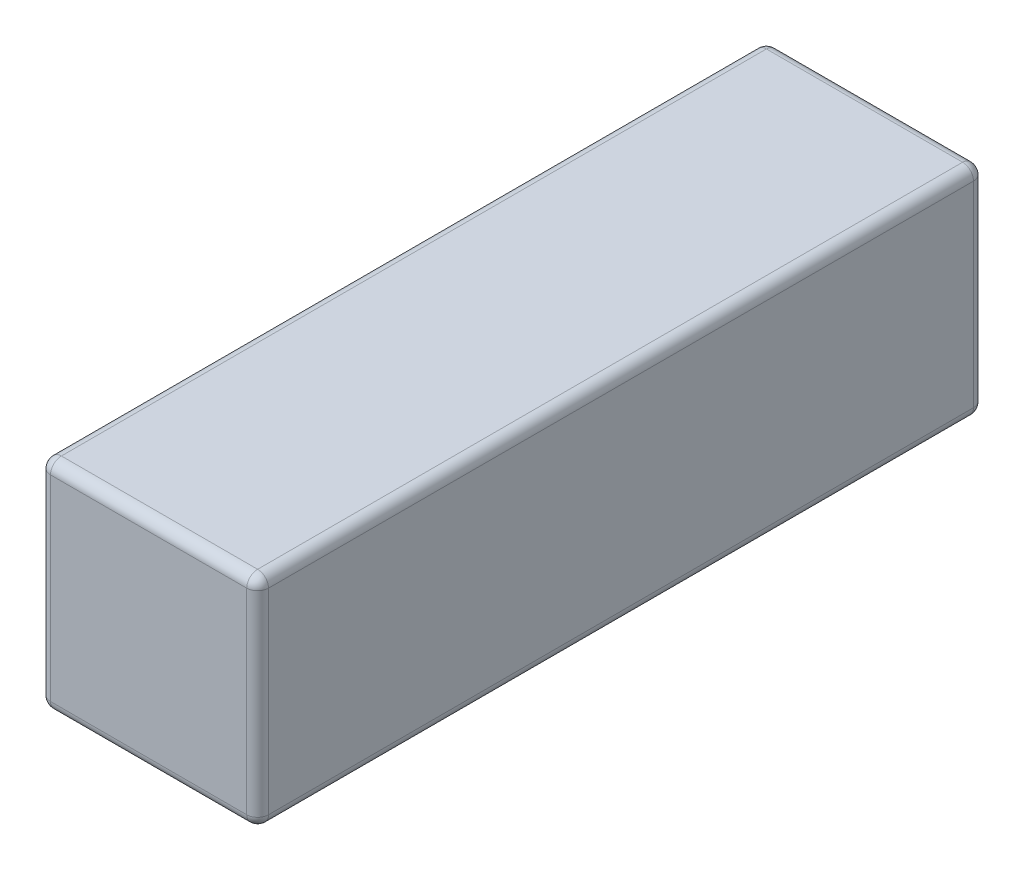
ISO-10303-21;
HEADER;
FILE_DESCRIPTION(('STEP AP214'),'2;1');
FILE_NAME('part.step','',(''),(''),'','','');
FILE_SCHEMA(('AUTOMOTIVE_DESIGN { 1 0 10303 214 1 1 1 1 }'));
ENDSEC;
DATA;
#1=APPLICATION_CONTEXT('core data for automotive mechanical design processes');
#2=APPLICATION_PROTOCOL_DEFINITION('international standard','automotive_design',2000,#1);
#3=PRODUCT_CONTEXT('',#1,'mechanical');
#4=PRODUCT('Part','Part','',(#3));
#5=PRODUCT_RELATED_PRODUCT_CATEGORY('part','',(#4));
#6=PRODUCT_DEFINITION_FORMATION('','',#4);
#7=PRODUCT_DEFINITION_CONTEXT('part definition',#1,'design');
#8=PRODUCT_DEFINITION('design','',#6,#7);
#9=PRODUCT_DEFINITION_SHAPE('','',#8);
#10=(LENGTH_UNIT() NAMED_UNIT(*) SI_UNIT(.MILLI.,.METRE.));
#11=(NAMED_UNIT(*) PLANE_ANGLE_UNIT() SI_UNIT($,.RADIAN.));
#12=(NAMED_UNIT(*) SI_UNIT($,.STERADIAN.) SOLID_ANGLE_UNIT());
#13=UNCERTAINTY_MEASURE_WITH_UNIT(LENGTH_MEASURE(1.E-05),#10,'distance_accuracy_value','');
#14=(GEOMETRIC_REPRESENTATION_CONTEXT(3) GLOBAL_UNCERTAINTY_ASSIGNED_CONTEXT((#13)) GLOBAL_UNIT_ASSIGNED_CONTEXT((#10,
#11,#12)) REPRESENTATION_CONTEXT('',''));
#15=CARTESIAN_POINT('',(0.,0.,0.));
#16=DIRECTION('',(0.,0.,1.));
#17=DIRECTION('',(1.,0.,0.));
#18=AXIS2_PLACEMENT_3D('',#15,#16,#17);
#19=CARTESIAN_POINT('',(1.5,-1.5,6.));
#20=DIRECTION('',(0.,1.,0.));
#21=DIRECTION('',(-1.,0.,0.));
#22=AXIS2_PLACEMENT_3D('',#19,#20,#21);
#23=PLANE('',#22);
#24=DIRECTION('',(0.,0.,-1.));
#25=VECTOR('',#24,1.);
#26=CARTESIAN_POINT('',(1.35,-1.5,6.));
#27=LINE('',#26,#25);
#28=CARTESIAN_POINT('',(1.35,-1.5,-5.85));
#29=VERTEX_POINT('',#28);
#30=CARTESIAN_POINT('',(1.35,-1.5,3.85));
#31=VERTEX_POINT('',#30);
#32=EDGE_CURVE('E140',#29,#31,#27,.F.);
#33=ORIENTED_EDGE('',*,*,#32,.T.);
#34=DIRECTION('',(1.,0.,0.));
#35=VECTOR('',#34,1.);
#36=CARTESIAN_POINT('',(1.5,-1.5,3.85));
#37=LINE('',#36,#35);
#38=CARTESIAN_POINT('',(-1.35,-1.5,3.85));
#39=VERTEX_POINT('',#38);
#40=EDGE_CURVE('E207',#31,#39,#37,.F.);
#41=ORIENTED_EDGE('',*,*,#40,.T.);
#42=DIRECTION('',(0.,0.,-1.));
#43=VECTOR('',#42,1.);
#44=CARTESIAN_POINT('',(-1.35,-1.5,6.));
#45=LINE('',#44,#43);
#46=CARTESIAN_POINT('',(-1.35,-1.5,-5.85));
#47=VERTEX_POINT('',#46);
#48=EDGE_CURVE('E143',#39,#47,#45,.T.);
#49=ORIENTED_EDGE('',*,*,#48,.T.);
#50=DIRECTION('',(1.,0.,0.));
#51=VECTOR('',#50,1.);
#52=CARTESIAN_POINT('',(1.5,-1.5,-5.85));
#53=LINE('',#52,#51);
#54=EDGE_CURVE('E138',#47,#29,#53,.T.);
#55=ORIENTED_EDGE('',*,*,#54,.T.);
#56=EDGE_LOOP('',(#33,#41,#49,#55));
#57=FACE_BOUND('',#56,.T.);
#58=ADVANCED_FACE('F47',(#57),#23,.F.);
#59=CARTESIAN_POINT('',(1.5,-1.5,6.));
#60=DIRECTION('',(-1.,0.,0.));
#61=DIRECTION('',(0.,0.,1.));
#62=AXIS2_PLACEMENT_3D('',#59,#60,#61);
#63=PLANE('',#62);
#64=DIRECTION('',(0.,0.,-1.));
#65=VECTOR('',#64,1.);
#66=CARTESIAN_POINT('',(1.5,1.35,6.));
#67=LINE('',#66,#65);
#68=CARTESIAN_POINT('',(1.5,1.35,-5.85));
#69=VERTEX_POINT('',#68);
#70=CARTESIAN_POINT('',(1.5,1.35,3.85));
#71=VERTEX_POINT('',#70);
#72=EDGE_CURVE('E195',#69,#71,#67,.F.);
#73=ORIENTED_EDGE('',*,*,#72,.T.);
#74=DIRECTION('',(0.,1.,0.));
#75=VECTOR('',#74,1.);
#76=CARTESIAN_POINT('',(1.5,-1.5,3.85));
#77=LINE('',#76,#75);
#78=CARTESIAN_POINT('',(1.5,-1.35,3.85));
#79=VERTEX_POINT('',#78);
#80=EDGE_CURVE('E204',#71,#79,#77,.F.);
#81=ORIENTED_EDGE('',*,*,#80,.T.);
#82=DIRECTION('',(0.,0.,-1.));
#83=VECTOR('',#82,1.);
#84=CARTESIAN_POINT('',(1.5,-1.35,6.));
#85=LINE('',#84,#83);
#86=CARTESIAN_POINT('',(1.5,-1.35,-5.85));
#87=VERTEX_POINT('',#86);
#88=EDGE_CURVE('E278',#79,#87,#85,.T.);
#89=ORIENTED_EDGE('',*,*,#88,.T.);
#90=DIRECTION('',(0.,1.,0.));
#91=VECTOR('',#90,1.);
#92=CARTESIAN_POINT('',(1.5,1.5,-5.85));
#93=LINE('',#92,#91);
#94=EDGE_CURVE('E279',#87,#69,#93,.T.);
#95=ORIENTED_EDGE('',*,*,#94,.T.);
#96=EDGE_LOOP('',(#73,#81,#89,#95));
#97=FACE_BOUND('',#96,.T.);
#98=ADVANCED_FACE('F284',(#97),#63,.F.);
#99=CARTESIAN_POINT('',(1.5,1.5,6.));
#100=DIRECTION('',(0.,-1.,0.));
#101=DIRECTION('',(1.,0.,0.));
#102=AXIS2_PLACEMENT_3D('',#99,#100,#101);
#103=PLANE('',#102);
#104=DIRECTION('',(0.,0.,-1.));
#105=VECTOR('',#104,1.);
#106=CARTESIAN_POINT('',(-1.35,1.5,6.));
#107=LINE('',#106,#105);
#108=CARTESIAN_POINT('',(-1.35,1.5,-5.85));
#109=VERTEX_POINT('',#108);
#110=CARTESIAN_POINT('',(-1.35,1.5,3.85));
#111=VERTEX_POINT('',#110);
#112=EDGE_CURVE('E276',#109,#111,#107,.F.);
#113=ORIENTED_EDGE('',*,*,#112,.T.);
#114=DIRECTION('',(-1.,0.,0.));
#115=VECTOR('',#114,1.);
#116=CARTESIAN_POINT('',(1.5,1.5,3.85));
#117=LINE('',#116,#115);
#118=CARTESIAN_POINT('',(1.35,1.5,3.85));
#119=VERTEX_POINT('',#118);
#120=EDGE_CURVE('E11',#111,#119,#117,.F.);
#121=ORIENTED_EDGE('',*,*,#120,.T.);
#122=DIRECTION('',(0.,0.,-1.));
#123=VECTOR('',#122,1.);
#124=CARTESIAN_POINT('',(1.35,1.5,6.));
#125=LINE('',#124,#123);
#126=CARTESIAN_POINT('',(1.35,1.5,-5.85));
#127=VERTEX_POINT('',#126);
#128=EDGE_CURVE('E272',#119,#127,#125,.T.);
#129=ORIENTED_EDGE('',*,*,#128,.T.);
#130=DIRECTION('',(-1.,0.,0.));
#131=VECTOR('',#130,1.);
#132=CARTESIAN_POINT('',(-1.5,1.5,-5.85));
#133=LINE('',#132,#131);
#134=EDGE_CURVE('E274',#127,#109,#133,.T.);
#135=ORIENTED_EDGE('',*,*,#134,.T.);
#136=EDGE_LOOP('',(#113,#121,#129,#135));
#137=FACE_BOUND('',#136,.T.);
#138=ADVANCED_FACE('F306',(#137),#103,.F.);
#139=CARTESIAN_POINT('',(-1.5,-1.5,6.));
#140=DIRECTION('',(1.,0.,0.));
#141=DIRECTION('',(0.,0.,-1.));
#142=AXIS2_PLACEMENT_3D('',#139,#140,#141);
#143=PLANE('',#142);
#144=DIRECTION('',(0.,0.,-1.));
#145=VECTOR('',#144,1.);
#146=CARTESIAN_POINT('',(-1.5,-1.35,6.));
#147=LINE('',#146,#145);
#148=CARTESIAN_POINT('',(-1.5,-1.35,-5.85));
#149=VERTEX_POINT('',#148);
#150=CARTESIAN_POINT('',(-1.5,-1.35,3.85));
#151=VERTEX_POINT('',#150);
#152=EDGE_CURVE('E258',#149,#151,#147,.F.);
#153=ORIENTED_EDGE('',*,*,#152,.T.);
#154=DIRECTION('',(0.,-1.,0.));
#155=VECTOR('',#154,1.);
#156=CARTESIAN_POINT('',(-1.5,-1.5,3.85));
#157=LINE('',#156,#155);
#158=CARTESIAN_POINT('',(-1.5,1.35,3.85));
#159=VERTEX_POINT('',#158);
#160=EDGE_CURVE('E71',#151,#159,#157,.F.);
#161=ORIENTED_EDGE('',*,*,#160,.T.);
#162=DIRECTION('',(0.,0.,-1.));
#163=VECTOR('',#162,1.);
#164=CARTESIAN_POINT('',(-1.5,1.35,6.));
#165=LINE('',#164,#163);
#166=CARTESIAN_POINT('',(-1.5,1.35,-5.85));
#167=VERTEX_POINT('',#166);
#168=EDGE_CURVE('E265',#159,#167,#165,.T.);
#169=ORIENTED_EDGE('',*,*,#168,.T.);
#170=DIRECTION('',(0.,-1.,0.));
#171=VECTOR('',#170,1.);
#172=CARTESIAN_POINT('',(-1.5,-1.5,-5.85));
#173=LINE('',#172,#171);
#174=EDGE_CURVE('E255',#167,#149,#173,.T.);
#175=ORIENTED_EDGE('',*,*,#174,.T.);
#176=EDGE_LOOP('',(#153,#161,#169,#175));
#177=FACE_BOUND('',#176,.T.);
#178=ADVANCED_FACE('F472',(#177),#143,.F.);
#179=CARTESIAN_POINT('',(0.,0.,-6.));
#180=DIRECTION('',(0.,0.,-1.));
#181=DIRECTION('',(-1.,0.,0.));
#182=AXIS2_PLACEMENT_3D('',#179,#180,#181);
#183=PLANE('',#182);
#184=DIRECTION('',(1.,0.,0.));
#185=VECTOR('',#184,1.);
#186=CARTESIAN_POINT('',(-1.5,-1.35,-6.));
#187=LINE('',#186,#185);
#188=CARTESIAN_POINT('',(1.35,-1.35,-6.));
#189=VERTEX_POINT('',#188);
#190=CARTESIAN_POINT('',(-1.35,-1.35,-6.));
#191=VERTEX_POINT('',#190);
#192=EDGE_CURVE('E170',#189,#191,#187,.F.);
#193=ORIENTED_EDGE('',*,*,#192,.T.);
#194=DIRECTION('',(0.,-1.,0.));
#195=VECTOR('',#194,1.);
#196=CARTESIAN_POINT('',(-1.35,1.5,-6.));
#197=LINE('',#196,#195);
#198=CARTESIAN_POINT('',(-1.35,1.35,-6.));
#199=VERTEX_POINT('',#198);
#200=EDGE_CURVE('E257',#191,#199,#197,.F.);
#201=ORIENTED_EDGE('',*,*,#200,.T.);
#202=DIRECTION('',(-1.,0.,0.));
#203=VECTOR('',#202,1.);
#204=CARTESIAN_POINT('',(1.5,1.35,-6.));
#205=LINE('',#204,#203);
#206=CARTESIAN_POINT('',(1.35,1.35,-6.));
#207=VERTEX_POINT('',#206);
#208=EDGE_CURVE('E263',#199,#207,#205,.F.);
#209=ORIENTED_EDGE('',*,*,#208,.T.);
#210=DIRECTION('',(0.,1.,0.));
#211=VECTOR('',#210,1.);
#212=CARTESIAN_POINT('',(1.35,-1.5,-6.));
#213=LINE('',#212,#211);
#214=EDGE_CURVE('E261',#207,#189,#213,.F.);
#215=ORIENTED_EDGE('',*,*,#214,.T.);
#216=EDGE_LOOP('',(#193,#201,#209,#215));
#217=FACE_BOUND('',#216,.T.);
#218=ADVANCED_FACE('F300',(#217),#183,.T.);
#219=CARTESIAN_POINT('',(1.35,1.35,6.));
#220=DIRECTION('',(0.,0.,-1.));
#221=DIRECTION('',(-1.,0.,0.));
#222=AXIS2_PLACEMENT_3D('',#219,#220,#221);
#223=CYLINDRICAL_SURFACE('',#222,0.15);
#224=ORIENTED_EDGE('',*,*,#128,.F.);
#225=CARTESIAN_POINT('',(1.35,1.35,3.85));
#226=DIRECTION('',(0.,0.,-1.));
#227=DIRECTION('',(-1.,0.,0.));
#228=AXIS2_PLACEMENT_3D('',#225,#226,#227);
#229=CIRCLE('',#228,0.15);
#230=EDGE_CURVE('E191',#119,#71,#229,.T.);
#231=ORIENTED_EDGE('',*,*,#230,.T.);
#232=ORIENTED_EDGE('',*,*,#72,.F.);
#233=CARTESIAN_POINT('',(1.35,1.35,-5.85));
#234=DIRECTION('',(0.,0.,-1.));
#235=DIRECTION('',(-1.,0.,0.));
#236=AXIS2_PLACEMENT_3D('',#233,#234,#235);
#237=CIRCLE('',#236,0.15);
#238=EDGE_CURVE('E158',#127,#69,#237,.T.);
#239=ORIENTED_EDGE('',*,*,#238,.F.);
#240=EDGE_LOOP('',(#224,#231,#232,#239));
#241=FACE_BOUND('',#240,.T.);
#242=ADVANCED_FACE('F289',(#241),#223,.T.);
#243=CARTESIAN_POINT('',(1.35,1.35,-5.85));
#244=DIRECTION('',(0.,0.,1.));
#245=DIRECTION('',(1.,0.,0.));
#246=AXIS2_PLACEMENT_3D('',#243,#244,#245);
#247=SPHERICAL_SURFACE('',#246,0.15);
#248=CARTESIAN_POINT('',(1.35,1.35,-5.85));
#249=DIRECTION('',(1.,0.,0.));
#250=DIRECTION('',(0.,0.,-1.));
#251=AXIS2_PLACEMENT_3D('',#248,#249,#250);
#252=CIRCLE('',#251,0.15);
#253=EDGE_CURVE('E167',#127,#207,#252,.F.);
#254=ORIENTED_EDGE('',*,*,#253,.F.);
#255=ORIENTED_EDGE('',*,*,#238,.T.);
#256=CARTESIAN_POINT('',(1.35,1.35,-5.85));
#257=DIRECTION('',(0.,1.,0.));
#258=DIRECTION('',(0.,0.,1.));
#259=AXIS2_PLACEMENT_3D('',#256,#257,#258);
#260=CIRCLE('',#259,0.15);
#261=EDGE_CURVE('E186',#207,#69,#260,.F.);
#262=ORIENTED_EDGE('',*,*,#261,.F.);
#263=EDGE_LOOP('',(#254,#255,#262));
#264=FACE_BOUND('',#263,.T.);
#265=ADVANCED_FACE('F294',(#264),#247,.T.);
#266=CARTESIAN_POINT('',(1.35,-1.35,6.));
#267=DIRECTION('',(0.,0.,-1.));
#268=DIRECTION('',(-1.,0.,0.));
#269=AXIS2_PLACEMENT_3D('',#266,#267,#268);
#270=CYLINDRICAL_SURFACE('',#269,0.15);
#271=ORIENTED_EDGE('',*,*,#88,.F.);
#272=CARTESIAN_POINT('',(1.35,-1.35,3.85));
#273=DIRECTION('',(0.,0.,-1.));
#274=DIRECTION('',(-1.,0.,0.));
#275=AXIS2_PLACEMENT_3D('',#272,#273,#274);
#276=CIRCLE('',#275,0.15);
#277=EDGE_CURVE('E157',#79,#31,#276,.T.);
#278=ORIENTED_EDGE('',*,*,#277,.T.);
#279=ORIENTED_EDGE('',*,*,#32,.F.);
#280=CARTESIAN_POINT('',(1.35,-1.35,-5.85));
#281=DIRECTION('',(0.,0.,-1.));
#282=DIRECTION('',(-1.,0.,0.));
#283=AXIS2_PLACEMENT_3D('',#280,#281,#282);
#284=CIRCLE('',#283,0.15);
#285=EDGE_CURVE('E154',#87,#29,#284,.T.);
#286=ORIENTED_EDGE('',*,*,#285,.F.);
#287=EDGE_LOOP('',(#271,#278,#279,#286));
#288=FACE_BOUND('',#287,.T.);
#289=ADVANCED_FACE('F153',(#288),#270,.T.);
#290=CARTESIAN_POINT('',(1.35,-1.5,-5.85));
#291=DIRECTION('',(0.,-1.,0.));
#292=DIRECTION('',(0.,0.,-1.));
#293=AXIS2_PLACEMENT_3D('',#290,#291,#292);
#294=CYLINDRICAL_SURFACE('',#293,0.15);
#295=ORIENTED_EDGE('',*,*,#261,.T.);
#296=ORIENTED_EDGE('',*,*,#94,.F.);
#297=CARTESIAN_POINT('',(1.35,-1.35,-5.85));
#298=DIRECTION('',(0.,-1.,0.));
#299=DIRECTION('',(0.,0.,-1.));
#300=AXIS2_PLACEMENT_3D('',#297,#298,#299);
#301=CIRCLE('',#300,0.15);
#302=EDGE_CURVE('E166',#189,#87,#301,.T.);
#303=ORIENTED_EDGE('',*,*,#302,.F.);
#304=ORIENTED_EDGE('',*,*,#214,.F.);
#305=EDGE_LOOP('',(#295,#296,#303,#304));
#306=FACE_BOUND('',#305,.T.);
#307=ADVANCED_FACE('F298',(#306),#294,.T.);
#308=CARTESIAN_POINT('',(1.5,1.35,-5.85));
#309=DIRECTION('',(1.,0.,0.));
#310=DIRECTION('',(0.,1.,0.));
#311=AXIS2_PLACEMENT_3D('',#308,#309,#310);
#312=CYLINDRICAL_SURFACE('',#311,0.15);
#313=ORIENTED_EDGE('',*,*,#253,.T.);
#314=ORIENTED_EDGE('',*,*,#208,.F.);
#315=CARTESIAN_POINT('',(-1.35,1.35,-5.85));
#316=DIRECTION('',(-1.,0.,0.));
#317=DIRECTION('',(0.,0.,1.));
#318=AXIS2_PLACEMENT_3D('',#315,#316,#317);
#319=CIRCLE('',#318,0.15);
#320=EDGE_CURVE('E175',#109,#199,#319,.T.);
#321=ORIENTED_EDGE('',*,*,#320,.F.);
#322=ORIENTED_EDGE('',*,*,#134,.F.);
#323=EDGE_LOOP('',(#313,#314,#321,#322));
#324=FACE_BOUND('',#323,.T.);
#325=ADVANCED_FACE('F304',(#324),#312,.T.);
#326=CARTESIAN_POINT('',(-1.35,1.35,6.));
#327=DIRECTION('',(0.,0.,-1.));
#328=DIRECTION('',(-1.,0.,0.));
#329=AXIS2_PLACEMENT_3D('',#326,#327,#328);
#330=CYLINDRICAL_SURFACE('',#329,0.15);
#331=ORIENTED_EDGE('',*,*,#168,.F.);
#332=CARTESIAN_POINT('',(-1.35,1.35,3.85));
#333=DIRECTION('',(0.,0.,-1.));
#334=DIRECTION('',(-1.,0.,0.));
#335=AXIS2_PLACEMENT_3D('',#332,#333,#334);
#336=CIRCLE('',#335,0.15);
#337=EDGE_CURVE('E56',#159,#111,#336,.T.);
#338=ORIENTED_EDGE('',*,*,#337,.T.);
#339=ORIENTED_EDGE('',*,*,#112,.F.);
#340=CARTESIAN_POINT('',(-1.35,1.35,-5.85));
#341=DIRECTION('',(0.,0.,-1.));
#342=DIRECTION('',(-1.,0.,0.));
#343=AXIS2_PLACEMENT_3D('',#340,#341,#342);
#344=CIRCLE('',#343,0.15);
#345=EDGE_CURVE('E171',#167,#109,#344,.T.);
#346=ORIENTED_EDGE('',*,*,#345,.F.);
#347=EDGE_LOOP('',(#331,#338,#339,#346));
#348=FACE_BOUND('',#347,.T.);
#349=ADVANCED_FACE('F309',(#348),#330,.T.);
#350=CARTESIAN_POINT('',(1.35,-1.35,-5.85));
#351=DIRECTION('',(0.,0.,1.));
#352=DIRECTION('',(1.,0.,0.));
#353=AXIS2_PLACEMENT_3D('',#350,#351,#352);
#354=SPHERICAL_SURFACE('',#353,0.15);
#355=ORIENTED_EDGE('',*,*,#302,.T.);
#356=ORIENTED_EDGE('',*,*,#285,.T.);
#357=CARTESIAN_POINT('',(1.35,-1.35,-5.85));
#358=DIRECTION('',(1.,0.,0.));
#359=DIRECTION('',(0.,0.,-1.));
#360=AXIS2_PLACEMENT_3D('',#357,#358,#359);
#361=CIRCLE('',#360,0.15);
#362=EDGE_CURVE('E163',#189,#29,#361,.F.);
#363=ORIENTED_EDGE('',*,*,#362,.F.);
#364=EDGE_LOOP('',(#355,#356,#363));
#365=FACE_BOUND('',#364,.T.);
#366=ADVANCED_FACE('F162',(#365),#354,.T.);
#367=CARTESIAN_POINT('',(-1.35,1.35,-5.85));
#368=DIRECTION('',(0.,0.,1.));
#369=DIRECTION('',(1.,0.,0.));
#370=AXIS2_PLACEMENT_3D('',#367,#368,#369);
#371=SPHERICAL_SURFACE('',#370,0.15);
#372=ORIENTED_EDGE('',*,*,#345,.T.);
#373=ORIENTED_EDGE('',*,*,#320,.T.);
#374=CARTESIAN_POINT('',(-1.35,1.35,-5.85));
#375=DIRECTION('',(0.,1.,0.));
#376=DIRECTION('',(0.,0.,1.));
#377=AXIS2_PLACEMENT_3D('',#374,#375,#376);
#378=CIRCLE('',#377,0.15);
#379=EDGE_CURVE('E172',#167,#199,#378,.F.);
#380=ORIENTED_EDGE('',*,*,#379,.F.);
#381=EDGE_LOOP('',(#372,#373,#380));
#382=FACE_BOUND('',#381,.T.);
#383=ADVANCED_FACE('F313',(#382),#371,.T.);
#384=CARTESIAN_POINT('',(1.5,-1.35,-5.85));
#385=DIRECTION('',(-1.,0.,0.));
#386=DIRECTION('',(0.,-1.,0.));
#387=AXIS2_PLACEMENT_3D('',#384,#385,#386);
#388=CYLINDRICAL_SURFACE('',#387,0.15);
#389=ORIENTED_EDGE('',*,*,#362,.T.);
#390=ORIENTED_EDGE('',*,*,#54,.F.);
#391=CARTESIAN_POINT('',(-1.35,-1.35,-5.85));
#392=DIRECTION('',(-1.,0.,0.));
#393=DIRECTION('',(0.,0.,1.));
#394=AXIS2_PLACEMENT_3D('',#391,#392,#393);
#395=CIRCLE('',#394,0.15);
#396=EDGE_CURVE('E177',#191,#47,#395,.T.);
#397=ORIENTED_EDGE('',*,*,#396,.F.);
#398=ORIENTED_EDGE('',*,*,#192,.F.);
#399=EDGE_LOOP('',(#389,#390,#397,#398));
#400=FACE_BOUND('',#399,.T.);
#401=ADVANCED_FACE('F169',(#400),#388,.T.);
#402=CARTESIAN_POINT('',(-1.35,-1.5,-5.85));
#403=DIRECTION('',(0.,1.,0.));
#404=DIRECTION('',(0.,0.,1.));
#405=AXIS2_PLACEMENT_3D('',#402,#403,#404);
#406=CYLINDRICAL_SURFACE('',#405,0.15);
#407=ORIENTED_EDGE('',*,*,#379,.T.);
#408=ORIENTED_EDGE('',*,*,#200,.F.);
#409=CARTESIAN_POINT('',(-1.35,-1.35,-5.85));
#410=DIRECTION('',(0.,-1.,0.));
#411=DIRECTION('',(0.,0.,-1.));
#412=AXIS2_PLACEMENT_3D('',#409,#410,#411);
#413=CIRCLE('',#412,0.15);
#414=EDGE_CURVE('E238',#149,#191,#413,.T.);
#415=ORIENTED_EDGE('',*,*,#414,.F.);
#416=ORIENTED_EDGE('',*,*,#174,.F.);
#417=EDGE_LOOP('',(#407,#408,#415,#416));
#418=FACE_BOUND('',#417,.T.);
#419=ADVANCED_FACE('F254',(#418),#406,.T.);
#420=CARTESIAN_POINT('',(-1.35,-1.35,-5.85));
#421=DIRECTION('',(0.,0.,1.));
#422=DIRECTION('',(1.,0.,0.));
#423=AXIS2_PLACEMENT_3D('',#420,#421,#422);
#424=SPHERICAL_SURFACE('',#423,0.15);
#425=ORIENTED_EDGE('',*,*,#414,.T.);
#426=ORIENTED_EDGE('',*,*,#396,.T.);
#427=CARTESIAN_POINT('',(-1.35,-1.35,-5.85));
#428=DIRECTION('',(0.,0.,-1.));
#429=DIRECTION('',(-1.,0.,0.));
#430=AXIS2_PLACEMENT_3D('',#427,#428,#429);
#431=CIRCLE('',#430,0.15);
#432=EDGE_CURVE('E235',#149,#47,#431,.F.);
#433=ORIENTED_EDGE('',*,*,#432,.F.);
#434=EDGE_LOOP('',(#425,#426,#433));
#435=FACE_BOUND('',#434,.T.);
#436=ADVANCED_FACE('F249',(#435),#424,.T.);
#437=CARTESIAN_POINT('',(-1.35,-1.35,6.));
#438=DIRECTION('',(0.,0.,-1.));
#439=DIRECTION('',(-1.,0.,0.));
#440=AXIS2_PLACEMENT_3D('',#437,#438,#439);
#441=CYLINDRICAL_SURFACE('',#440,0.15);
#442=ORIENTED_EDGE('',*,*,#48,.F.);
#443=CARTESIAN_POINT('',(-1.35,-1.35,3.85));
#444=DIRECTION('',(0.,0.,-1.));
#445=DIRECTION('',(-1.,0.,0.));
#446=AXIS2_PLACEMENT_3D('',#443,#444,#445);
#447=CIRCLE('',#446,0.15);
#448=EDGE_CURVE('E209',#39,#151,#447,.T.);
#449=ORIENTED_EDGE('',*,*,#448,.T.);
#450=ORIENTED_EDGE('',*,*,#152,.F.);
#451=ORIENTED_EDGE('',*,*,#432,.T.);
#452=EDGE_LOOP('',(#442,#449,#450,#451));
#453=FACE_BOUND('',#452,.T.);
#454=ADVANCED_FACE('F259',(#453),#441,.T.);
#455=CARTESIAN_POINT('',(0.,0.,4.));
#456=DIRECTION('',(0.,0.,-1.));
#457=DIRECTION('',(-1.,0.,0.));
#458=AXIS2_PLACEMENT_3D('',#455,#456,#457);
#459=PLANE('',#458);
#460=DIRECTION('',(1.,0.,0.));
#461=VECTOR('',#460,1.);
#462=CARTESIAN_POINT('',(0.,-1.35,4.));
#463=LINE('',#462,#461);
#464=CARTESIAN_POINT('',(-1.35,-1.35,4.));
#465=VERTEX_POINT('',#464);
#466=CARTESIAN_POINT('',(1.35,-1.35,4.));
#467=VERTEX_POINT('',#466);
#468=EDGE_CURVE('E199',#465,#467,#463,.T.);
#469=ORIENTED_EDGE('',*,*,#468,.T.);
#470=DIRECTION('',(0.,1.,0.));
#471=VECTOR('',#470,1.);
#472=CARTESIAN_POINT('',(1.35,0.,4.));
#473=LINE('',#472,#471);
#474=CARTESIAN_POINT('',(1.35,1.35,4.));
#475=VERTEX_POINT('',#474);
#476=EDGE_CURVE('E201',#467,#475,#473,.T.);
#477=ORIENTED_EDGE('',*,*,#476,.T.);
#478=DIRECTION('',(-1.,0.,0.));
#479=VECTOR('',#478,1.);
#480=CARTESIAN_POINT('',(0.,1.35,4.));
#481=LINE('',#480,#479);
#482=CARTESIAN_POINT('',(-1.35,1.35,4.));
#483=VERTEX_POINT('',#482);
#484=EDGE_CURVE('E194',#475,#483,#481,.T.);
#485=ORIENTED_EDGE('',*,*,#484,.T.);
#486=DIRECTION('',(0.,-1.,0.));
#487=VECTOR('',#486,1.);
#488=CARTESIAN_POINT('',(-1.35,0.,4.));
#489=LINE('',#488,#487);
#490=EDGE_CURVE('E197',#483,#465,#489,.T.);
#491=ORIENTED_EDGE('',*,*,#490,.T.);
#492=EDGE_LOOP('',(#469,#477,#485,#491));
#493=FACE_BOUND('',#492,.T.);
#494=ADVANCED_FACE('F333',(#493),#459,.F.);
#495=CARTESIAN_POINT('',(-1.35,-1.35,3.85));
#496=DIRECTION('',(0.,0.,-1.));
#497=DIRECTION('',(-1.,0.,0.));
#498=AXIS2_PLACEMENT_3D('',#495,#496,#497);
#499=SPHERICAL_SURFACE('',#498,0.15);
#500=CARTESIAN_POINT('',(-1.35,-1.35,3.85));
#501=DIRECTION('',(0.,1.,0.));
#502=DIRECTION('',(0.,0.,1.));
#503=AXIS2_PLACEMENT_3D('',#500,#501,#502);
#504=CIRCLE('',#503,0.15);
#505=EDGE_CURVE('E228',#151,#465,#504,.T.);
#506=ORIENTED_EDGE('',*,*,#505,.F.);
#507=ORIENTED_EDGE('',*,*,#448,.F.);
#508=CARTESIAN_POINT('',(-1.35,-1.35,3.85));
#509=DIRECTION('',(1.,0.,0.));
#510=DIRECTION('',(0.,0.,-1.));
#511=AXIS2_PLACEMENT_3D('',#508,#509,#510);
#512=CIRCLE('',#511,0.15);
#513=EDGE_CURVE('E51',#465,#39,#512,.T.);
#514=ORIENTED_EDGE('',*,*,#513,.F.);
#515=EDGE_LOOP('',(#506,#507,#514));
#516=FACE_BOUND('',#515,.T.);
#517=ADVANCED_FACE('F49',(#516),#499,.T.);
#518=CARTESIAN_POINT('',(0.,-1.35,3.85));
#519=DIRECTION('',(1.,0.,0.));
#520=DIRECTION('',(0.,1.,0.));
#521=AXIS2_PLACEMENT_3D('',#518,#519,#520);
#522=CYLINDRICAL_SURFACE('',#521,0.15);
#523=ORIENTED_EDGE('',*,*,#513,.T.);
#524=ORIENTED_EDGE('',*,*,#40,.F.);
#525=CARTESIAN_POINT('',(1.35,-1.35,3.85));
#526=DIRECTION('',(1.,0.,0.));
#527=DIRECTION('',(0.,0.,-1.));
#528=AXIS2_PLACEMENT_3D('',#525,#526,#527);
#529=CIRCLE('',#528,0.15);
#530=EDGE_CURVE('E226',#467,#31,#529,.T.);
#531=ORIENTED_EDGE('',*,*,#530,.F.);
#532=ORIENTED_EDGE('',*,*,#468,.F.);
#533=EDGE_LOOP('',(#523,#524,#531,#532));
#534=FACE_BOUND('',#533,.T.);
#535=ADVANCED_FACE('F366',(#534),#522,.T.);
#536=CARTESIAN_POINT('',(-1.35,0.,3.85));
#537=DIRECTION('',(0.,-1.,0.));
#538=DIRECTION('',(0.,0.,-1.));
#539=AXIS2_PLACEMENT_3D('',#536,#537,#538);
#540=CYLINDRICAL_SURFACE('',#539,0.15);
#541=ORIENTED_EDGE('',*,*,#505,.T.);
#542=ORIENTED_EDGE('',*,*,#490,.F.);
#543=CARTESIAN_POINT('',(-1.35,1.35,3.85));
#544=DIRECTION('',(0.,1.,0.));
#545=DIRECTION('',(0.,0.,1.));
#546=AXIS2_PLACEMENT_3D('',#543,#544,#545);
#547=CIRCLE('',#546,0.15);
#548=EDGE_CURVE('E223',#159,#483,#547,.T.);
#549=ORIENTED_EDGE('',*,*,#548,.F.);
#550=ORIENTED_EDGE('',*,*,#160,.F.);
#551=EDGE_LOOP('',(#541,#542,#549,#550));
#552=FACE_BOUND('',#551,.T.);
#553=ADVANCED_FACE('F376',(#552),#540,.T.);
#554=CARTESIAN_POINT('',(1.35,-1.35,3.85));
#555=DIRECTION('',(0.,0.,-1.));
#556=DIRECTION('',(-1.,0.,0.));
#557=AXIS2_PLACEMENT_3D('',#554,#555,#556);
#558=SPHERICAL_SURFACE('',#557,0.15);
#559=ORIENTED_EDGE('',*,*,#530,.T.);
#560=ORIENTED_EDGE('',*,*,#277,.F.);
#561=CARTESIAN_POINT('',(1.35,-1.35,3.85));
#562=DIRECTION('',(0.,1.,0.));
#563=DIRECTION('',(0.,0.,1.));
#564=AXIS2_PLACEMENT_3D('',#561,#562,#563);
#565=CIRCLE('',#564,0.15);
#566=EDGE_CURVE('E220',#467,#79,#565,.T.);
#567=ORIENTED_EDGE('',*,*,#566,.F.);
#568=EDGE_LOOP('',(#559,#560,#567));
#569=FACE_BOUND('',#568,.T.);
#570=ADVANCED_FACE('F384',(#569),#558,.T.);
#571=CARTESIAN_POINT('',(-1.35,1.35,3.85));
#572=DIRECTION('',(0.,0.,-1.));
#573=DIRECTION('',(-1.,0.,0.));
#574=AXIS2_PLACEMENT_3D('',#571,#572,#573);
#575=SPHERICAL_SURFACE('',#574,0.15);
#576=ORIENTED_EDGE('',*,*,#337,.F.);
#577=ORIENTED_EDGE('',*,*,#548,.T.);
#578=CARTESIAN_POINT('',(-1.35,1.35,3.85));
#579=DIRECTION('',(1.,0.,0.));
#580=DIRECTION('',(0.,0.,-1.));
#581=AXIS2_PLACEMENT_3D('',#578,#579,#580);
#582=CIRCLE('',#581,0.15);
#583=EDGE_CURVE('E217',#111,#483,#582,.T.);
#584=ORIENTED_EDGE('',*,*,#583,.F.);
#585=EDGE_LOOP('',(#576,#577,#584));
#586=FACE_BOUND('',#585,.T.);
#587=ADVANCED_FACE('F393',(#586),#575,.T.);
#588=CARTESIAN_POINT('',(1.35,0.,3.85));
#589=DIRECTION('',(0.,1.,0.));
#590=DIRECTION('',(0.,0.,1.));
#591=AXIS2_PLACEMENT_3D('',#588,#589,#590);
#592=CYLINDRICAL_SURFACE('',#591,0.15);
#593=ORIENTED_EDGE('',*,*,#566,.T.);
#594=ORIENTED_EDGE('',*,*,#80,.F.);
#595=CARTESIAN_POINT('',(1.35,1.35,3.85));
#596=DIRECTION('',(0.,1.,0.));
#597=DIRECTION('',(0.,0.,1.));
#598=AXIS2_PLACEMENT_3D('',#595,#596,#597);
#599=CIRCLE('',#598,0.15);
#600=EDGE_CURVE('E215',#475,#71,#599,.T.);
#601=ORIENTED_EDGE('',*,*,#600,.F.);
#602=ORIENTED_EDGE('',*,*,#476,.F.);
#603=EDGE_LOOP('',(#593,#594,#601,#602));
#604=FACE_BOUND('',#603,.T.);
#605=ADVANCED_FACE('F404',(#604),#592,.T.);
#606=CARTESIAN_POINT('',(0.,1.35,3.85));
#607=DIRECTION('',(-1.,0.,0.));
#608=DIRECTION('',(0.,-1.,0.));
#609=AXIS2_PLACEMENT_3D('',#606,#607,#608);
#610=CYLINDRICAL_SURFACE('',#609,0.15);
#611=ORIENTED_EDGE('',*,*,#583,.T.);
#612=ORIENTED_EDGE('',*,*,#484,.F.);
#613=CARTESIAN_POINT('',(1.35,1.35,3.85));
#614=DIRECTION('',(1.,0.,0.));
#615=DIRECTION('',(0.,0.,-1.));
#616=AXIS2_PLACEMENT_3D('',#613,#614,#615);
#617=CIRCLE('',#616,0.15);
#618=EDGE_CURVE('E213',#119,#475,#617,.T.);
#619=ORIENTED_EDGE('',*,*,#618,.F.);
#620=ORIENTED_EDGE('',*,*,#120,.F.);
#621=EDGE_LOOP('',(#611,#612,#619,#620));
#622=FACE_BOUND('',#621,.T.);
#623=ADVANCED_FACE('F415',(#622),#610,.T.);
#624=CARTESIAN_POINT('',(1.35,1.35,3.85));
#625=DIRECTION('',(0.,0.,-1.));
#626=DIRECTION('',(-1.,0.,0.));
#627=AXIS2_PLACEMENT_3D('',#624,#625,#626);
#628=SPHERICAL_SURFACE('',#627,0.15);
#629=ORIENTED_EDGE('',*,*,#600,.T.);
#630=ORIENTED_EDGE('',*,*,#230,.F.);
#631=ORIENTED_EDGE('',*,*,#618,.T.);
#632=EDGE_LOOP('',(#629,#630,#631));
#633=FACE_BOUND('',#632,.T.);
#634=ADVANCED_FACE('F425',(#633),#628,.T.);
#635=CLOSED_SHELL('',(#58,#98,#138,#178,#218,#242,#265,#289,#307,#325,#349,#366,#383,#401,#419,
#436,#454,#494,#517,#535,#553,#570,#587,#605,#623,#634));
#636=MANIFOLD_SOLID_BREP('B2',#635);
#637=ADVANCED_BREP_SHAPE_REPRESENTATION('',(#18,#636),#14);
#638=SHAPE_DEFINITION_REPRESENTATION(#9,#637);
ENDSEC;
END-ISO-10303-21;
